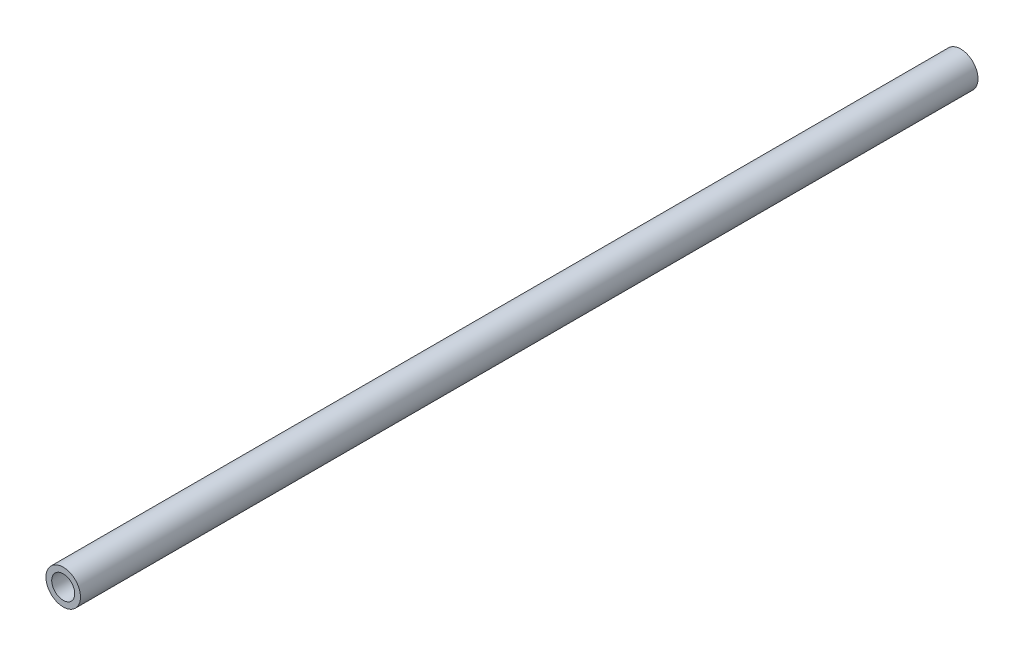
ISO-10303-21;
HEADER;
FILE_DESCRIPTION(('STEP AP214'),'2;1');
FILE_NAME('part.step','',(''),(''),'','','');
FILE_SCHEMA(('AUTOMOTIVE_DESIGN { 1 0 10303 214 1 1 1 1 }'));
ENDSEC;
DATA;
#1=APPLICATION_CONTEXT('core data for automotive mechanical design processes');
#2=APPLICATION_PROTOCOL_DEFINITION('international standard','automotive_design',2000,#1);
#3=PRODUCT_CONTEXT('',#1,'mechanical');
#4=PRODUCT('Part','Part','',(#3));
#5=PRODUCT_RELATED_PRODUCT_CATEGORY('part','',(#4));
#6=PRODUCT_DEFINITION_FORMATION('','',#4);
#7=PRODUCT_DEFINITION_CONTEXT('part definition',#1,'design');
#8=PRODUCT_DEFINITION('design','',#6,#7);
#9=PRODUCT_DEFINITION_SHAPE('','',#8);
#10=(LENGTH_UNIT() NAMED_UNIT(*) SI_UNIT(.MILLI.,.METRE.));
#11=(NAMED_UNIT(*) PLANE_ANGLE_UNIT() SI_UNIT($,.RADIAN.));
#12=(NAMED_UNIT(*) SI_UNIT($,.STERADIAN.) SOLID_ANGLE_UNIT());
#13=UNCERTAINTY_MEASURE_WITH_UNIT(LENGTH_MEASURE(1.E-05),#10,'distance_accuracy_value','');
#14=(GEOMETRIC_REPRESENTATION_CONTEXT(3) GLOBAL_UNCERTAINTY_ASSIGNED_CONTEXT((#13)) GLOBAL_UNIT_ASSIGNED_CONTEXT((#10,
#11,#12)) REPRESENTATION_CONTEXT('',''));
#15=CARTESIAN_POINT('',(0.,0.,0.));
#16=DIRECTION('',(0.,0.,1.));
#17=DIRECTION('',(1.,0.,0.));
#18=AXIS2_PLACEMENT_3D('',#15,#16,#17);
#19=CARTESIAN_POINT('',(0.,0.,123.825));
#20=DIRECTION('',(0.,0.,1.));
#21=DIRECTION('',(1.,0.,0.));
#22=AXIS2_PLACEMENT_3D('',#19,#20,#21);
#23=PLANE('',#22);
#24=CARTESIAN_POINT('',(0.,0.,123.825));
#25=DIRECTION('',(0.,0.,1.));
#26=DIRECTION('',(1.,0.,0.));
#27=AXIS2_PLACEMENT_3D('',#24,#25,#26);
#28=CIRCLE('',#27,4.7625);
#29=CARTESIAN_POINT('',(4.7625,0.,123.825));
#30=VERTEX_POINT('',#29);
#31=EDGE_CURVE('E10',#30,#30,#28,.T.);
#32=ORIENTED_EDGE('',*,*,#31,.T.);
#33=EDGE_LOOP('',(#32));
#34=FACE_BOUND('',#33,.T.);
#35=CARTESIAN_POINT('',(0.,0.,123.825));
#36=DIRECTION('',(0.,0.,1.));
#37=DIRECTION('',(1.,0.,0.));
#38=AXIS2_PLACEMENT_3D('',#35,#36,#37);
#39=CIRCLE('',#38,3.175);
#40=CARTESIAN_POINT('',(3.175,0.,123.825));
#41=VERTEX_POINT('',#40);
#42=EDGE_CURVE('E42',#41,#41,#39,.T.);
#43=ORIENTED_EDGE('',*,*,#42,.F.);
#44=EDGE_LOOP('',(#43));
#45=FACE_BOUND('',#44,.T.);
#46=ADVANCED_FACE('F31',(#34,#45),#23,.T.);
#47=CARTESIAN_POINT('',(0.,0.,-123.825));
#48=DIRECTION('',(0.,0.,1.));
#49=DIRECTION('',(1.,0.,0.));
#50=AXIS2_PLACEMENT_3D('',#47,#48,#49);
#51=PLANE('',#50);
#52=CARTESIAN_POINT('',(0.,0.,-123.825));
#53=DIRECTION('',(0.,0.,1.));
#54=DIRECTION('',(1.,0.,0.));
#55=AXIS2_PLACEMENT_3D('',#52,#53,#54);
#56=CIRCLE('',#55,4.7625);
#57=CARTESIAN_POINT('',(4.7625,0.,-123.825));
#58=VERTEX_POINT('',#57);
#59=EDGE_CURVE('E35',#58,#58,#56,.T.);
#60=ORIENTED_EDGE('',*,*,#59,.F.);
#61=EDGE_LOOP('',(#60));
#62=FACE_BOUND('',#61,.T.);
#63=CARTESIAN_POINT('',(0.,0.,-123.825));
#64=DIRECTION('',(0.,0.,1.));
#65=DIRECTION('',(1.,0.,0.));
#66=AXIS2_PLACEMENT_3D('',#63,#64,#65);
#67=CIRCLE('',#66,3.175);
#68=CARTESIAN_POINT('',(3.175,0.,-123.825));
#69=VERTEX_POINT('',#68);
#70=EDGE_CURVE('E44',#69,#69,#67,.T.);
#71=ORIENTED_EDGE('',*,*,#70,.T.);
#72=EDGE_LOOP('',(#71));
#73=FACE_BOUND('',#72,.T.);
#74=ADVANCED_FACE('F54',(#62,#73),#51,.F.);
#75=CARTESIAN_POINT('',(0.,0.,123.825));
#76=DIRECTION('',(0.,0.,-1.));
#77=DIRECTION('',(-1.,0.,0.));
#78=AXIS2_PLACEMENT_3D('',#75,#76,#77);
#79=CYLINDRICAL_SURFACE('',#78,4.7625);
#80=ORIENTED_EDGE('',*,*,#31,.F.);
#81=EDGE_LOOP('',(#80));
#82=FACE_BOUND('',#81,.T.);
#83=ORIENTED_EDGE('',*,*,#59,.T.);
#84=EDGE_LOOP('',(#83));
#85=FACE_BOUND('',#84,.T.);
#86=ADVANCED_FACE('F33',(#82,#85),#79,.T.);
#87=CARTESIAN_POINT('',(0.,0.,123.825));
#88=DIRECTION('',(0.,0.,-1.));
#89=DIRECTION('',(-1.,0.,0.));
#90=AXIS2_PLACEMENT_3D('',#87,#88,#89);
#91=CYLINDRICAL_SURFACE('',#90,3.175);
#92=ORIENTED_EDGE('',*,*,#42,.T.);
#93=EDGE_LOOP('',(#92));
#94=FACE_BOUND('',#93,.T.);
#95=ORIENTED_EDGE('',*,*,#70,.F.);
#96=EDGE_LOOP('',(#95));
#97=FACE_BOUND('',#96,.T.);
#98=ADVANCED_FACE('F50',(#94,#97),#91,.F.);
#99=CLOSED_SHELL('',(#46,#74,#86,#98));
#100=MANIFOLD_SOLID_BREP('B2',#99);
#101=ADVANCED_BREP_SHAPE_REPRESENTATION('',(#18,#100),#14);
#102=SHAPE_DEFINITION_REPRESENTATION(#9,#101);
ENDSEC;
END-ISO-10303-21;
